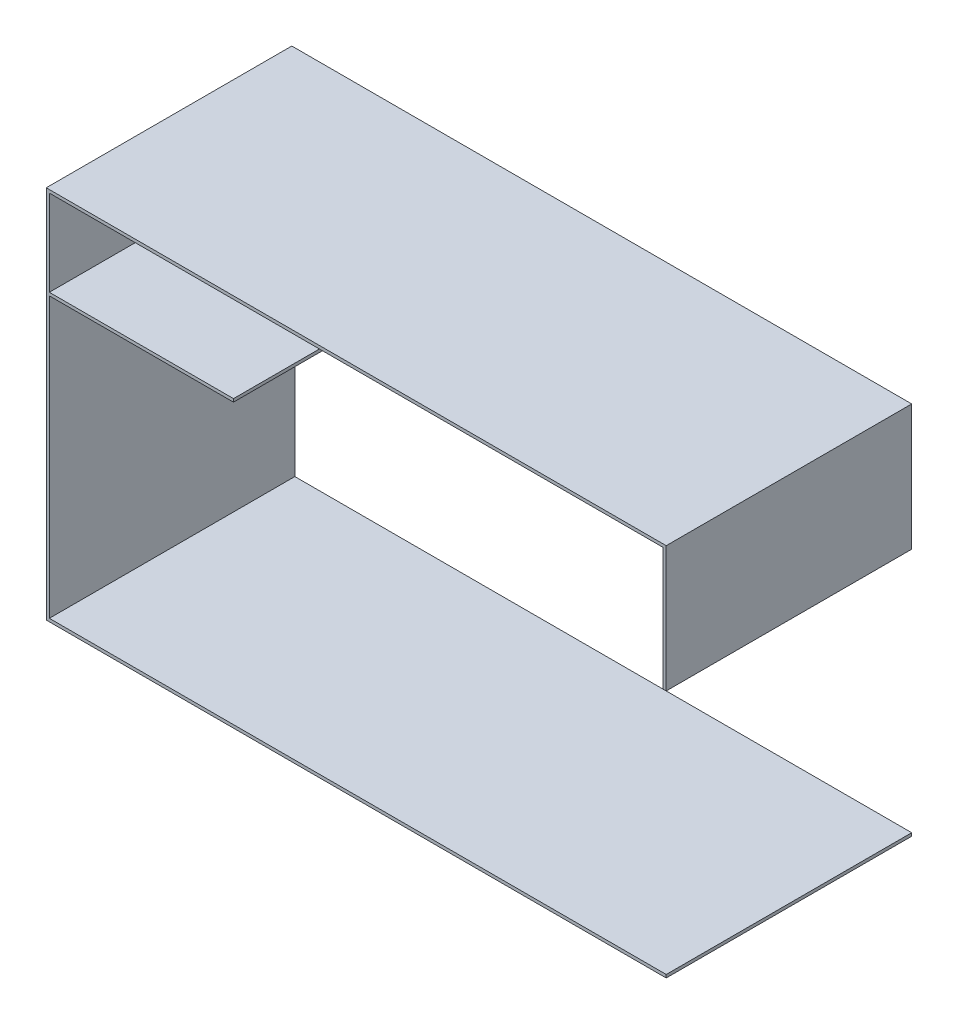
ISO-10303-21;
HEADER;
FILE_DESCRIPTION(('STEP AP214'),'2;1');
FILE_NAME('part.step','',(''),(''),'','','');
FILE_SCHEMA(('AUTOMOTIVE_DESIGN { 1 0 10303 214 1 1 1 1 }'));
ENDSEC;
DATA;
#1=APPLICATION_CONTEXT('core data for automotive mechanical design processes');
#2=APPLICATION_PROTOCOL_DEFINITION('international standard','automotive_design',2000,#1);
#3=PRODUCT_CONTEXT('',#1,'mechanical');
#4=PRODUCT('Part','Part','',(#3));
#5=PRODUCT_RELATED_PRODUCT_CATEGORY('part','',(#4));
#6=PRODUCT_DEFINITION_FORMATION('','',#4);
#7=PRODUCT_DEFINITION_CONTEXT('part definition',#1,'design');
#8=PRODUCT_DEFINITION('design','',#6,#7);
#9=PRODUCT_DEFINITION_SHAPE('','',#8);
#10=(LENGTH_UNIT() NAMED_UNIT(*) SI_UNIT(.MILLI.,.METRE.));
#11=(NAMED_UNIT(*) PLANE_ANGLE_UNIT() SI_UNIT($,.RADIAN.));
#12=(NAMED_UNIT(*) SI_UNIT($,.STERADIAN.) SOLID_ANGLE_UNIT());
#13=UNCERTAINTY_MEASURE_WITH_UNIT(LENGTH_MEASURE(1.E-05),#10,'distance_accuracy_value','');
#14=(GEOMETRIC_REPRESENTATION_CONTEXT(3) GLOBAL_UNCERTAINTY_ASSIGNED_CONTEXT((#13)) GLOBAL_UNIT_ASSIGNED_CONTEXT((#10,
#11,#12)) REPRESENTATION_CONTEXT('',''));
#15=CARTESIAN_POINT('',(0.,0.,0.));
#16=DIRECTION('',(0.,0.,1.));
#17=DIRECTION('',(1.,0.,0.));
#18=AXIS2_PLACEMENT_3D('',#15,#16,#17);
#19=CARTESIAN_POINT('',(-2500.,-1500.,2000.));
#20=DIRECTION('',(-1.,0.,0.));
#21=DIRECTION('',(0.,0.,1.));
#22=AXIS2_PLACEMENT_3D('',#19,#20,#21);
#23=PLANE('',#22);
#24=DIRECTION('',(0.,1.,0.));
#25=VECTOR('',#24,1.);
#26=CARTESIAN_POINT('',(-2500.,-1500.,0.));
#27=LINE('',#26,#25);
#28=CARTESIAN_POINT('',(-2500.,-1500.,0.));
#29=VERTEX_POINT('',#28);
#30=CARTESIAN_POINT('',(-2500.,775.,0.));
#31=VERTEX_POINT('',#30);
#32=EDGE_CURVE('E172',#29,#31,#27,.T.);
#33=ORIENTED_EDGE('',*,*,#32,.T.);
#34=DIRECTION('',(0.,0.,-1.));
#35=VECTOR('',#34,1.);
#36=CARTESIAN_POINT('',(-2500.,775.,2000.));
#37=LINE('',#36,#35);
#38=CARTESIAN_POINT('',(-2500.,775.,2000.));
#39=VERTEX_POINT('',#38);
#40=EDGE_CURVE('E44',#39,#31,#37,.T.);
#41=ORIENTED_EDGE('',*,*,#40,.F.);
#42=DIRECTION('',(0.,1.,0.));
#43=VECTOR('',#42,1.);
#44=CARTESIAN_POINT('',(-2500.,-1500.,2000.));
#45=LINE('',#44,#43);
#46=CARTESIAN_POINT('',(-2500.,-1500.,2000.));
#47=VERTEX_POINT('',#46);
#48=EDGE_CURVE('E114',#47,#39,#45,.T.);
#49=ORIENTED_EDGE('',*,*,#48,.F.);
#50=DIRECTION('',(0.,0.,-1.));
#51=VECTOR('',#50,1.);
#52=CARTESIAN_POINT('',(-2500.,-1500.,2000.));
#53=LINE('',#52,#51);
#54=EDGE_CURVE('E11',#47,#29,#53,.T.);
#55=ORIENTED_EDGE('',*,*,#54,.T.);
#56=EDGE_LOOP('',(#33,#41,#49,#55));
#57=FACE_BOUND('',#56,.T.);
#58=ADVANCED_FACE('F36',(#57),#23,.F.);
#59=CARTESIAN_POINT('',(-1000.,775.,2000.));
#60=DIRECTION('',(0.,-1.,0.));
#61=DIRECTION('',(1.,0.,0.));
#62=AXIS2_PLACEMENT_3D('',#59,#60,#61);
#63=PLANE('',#62);
#64=DIRECTION('',(-1.,0.,0.));
#65=VECTOR('',#64,1.);
#66=CARTESIAN_POINT('',(-1000.,775.,0.));
#67=LINE('',#66,#65);
#68=CARTESIAN_POINT('',(-1000.,775.,0.));
#69=VERTEX_POINT('',#68);
#70=EDGE_CURVE('E175',#69,#31,#67,.T.);
#71=ORIENTED_EDGE('',*,*,#70,.F.);
#72=DIRECTION('',(0.,0.,-1.));
#73=VECTOR('',#72,1.);
#74=CARTESIAN_POINT('',(-1000.,775.,2000.));
#75=LINE('',#74,#73);
#76=CARTESIAN_POINT('',(-1000.,775.,2000.));
#77=VERTEX_POINT('',#76);
#78=EDGE_CURVE('E223',#77,#69,#75,.T.);
#79=ORIENTED_EDGE('',*,*,#78,.F.);
#80=DIRECTION('',(-1.,0.,0.));
#81=VECTOR('',#80,1.);
#82=CARTESIAN_POINT('',(-1000.,775.,2000.));
#83=LINE('',#82,#81);
#84=EDGE_CURVE('E229',#77,#39,#83,.T.);
#85=ORIENTED_EDGE('',*,*,#84,.T.);
#86=ORIENTED_EDGE('',*,*,#40,.T.);
#87=EDGE_LOOP('',(#71,#79,#85,#86));
#88=FACE_BOUND('',#87,.T.);
#89=ADVANCED_FACE('F227',(#88),#63,.T.);
#90=CARTESIAN_POINT('',(-1000.,800.,2000.));
#91=DIRECTION('',(1.,0.,0.));
#92=DIRECTION('',(0.,1.,0.));
#93=AXIS2_PLACEMENT_3D('',#90,#91,#92);
#94=PLANE('',#93);
#95=DIRECTION('',(0.,-1.,0.));
#96=VECTOR('',#95,1.);
#97=CARTESIAN_POINT('',(-1000.,800.,0.));
#98=LINE('',#97,#96);
#99=CARTESIAN_POINT('',(-1000.,800.,0.));
#100=VERTEX_POINT('',#99);
#101=EDGE_CURVE('E178',#100,#69,#98,.T.);
#102=ORIENTED_EDGE('',*,*,#101,.F.);
#103=DIRECTION('',(0.,0.,-1.));
#104=VECTOR('',#103,1.);
#105=CARTESIAN_POINT('',(-1000.,800.,2000.));
#106=LINE('',#105,#104);
#107=CARTESIAN_POINT('',(-1000.,800.,2000.));
#108=VERTEX_POINT('',#107);
#109=EDGE_CURVE('E221',#108,#100,#106,.T.);
#110=ORIENTED_EDGE('',*,*,#109,.F.);
#111=DIRECTION('',(0.,-1.,0.));
#112=VECTOR('',#111,1.);
#113=CARTESIAN_POINT('',(-1000.,800.,2000.));
#114=LINE('',#113,#112);
#115=EDGE_CURVE('E241',#108,#77,#114,.T.);
#116=ORIENTED_EDGE('',*,*,#115,.T.);
#117=ORIENTED_EDGE('',*,*,#78,.T.);
#118=EDGE_LOOP('',(#102,#110,#116,#117));
#119=FACE_BOUND('',#118,.T.);
#120=ADVANCED_FACE('F238',(#119),#94,.T.);
#121=CARTESIAN_POINT('',(-2500.,800.,2000.));
#122=DIRECTION('',(0.,1.,0.));
#123=DIRECTION('',(-1.,0.,0.));
#124=AXIS2_PLACEMENT_3D('',#121,#122,#123);
#125=PLANE('',#124);
#126=DIRECTION('',(1.,0.,0.));
#127=VECTOR('',#126,1.);
#128=CARTESIAN_POINT('',(-2500.,800.,0.));
#129=LINE('',#128,#127);
#130=CARTESIAN_POINT('',(-2500.,800.,0.));
#131=VERTEX_POINT('',#130);
#132=EDGE_CURVE('E181',#131,#100,#129,.T.);
#133=ORIENTED_EDGE('',*,*,#132,.F.);
#134=DIRECTION('',(0.,0.,-1.));
#135=VECTOR('',#134,1.);
#136=CARTESIAN_POINT('',(-2500.,800.,2000.));
#137=LINE('',#136,#135);
#138=CARTESIAN_POINT('',(-2500.,800.,2000.));
#139=VERTEX_POINT('',#138);
#140=EDGE_CURVE('E219',#139,#131,#137,.T.);
#141=ORIENTED_EDGE('',*,*,#140,.F.);
#142=DIRECTION('',(1.,0.,0.));
#143=VECTOR('',#142,1.);
#144=CARTESIAN_POINT('',(-2500.,800.,2000.));
#145=LINE('',#144,#143);
#146=EDGE_CURVE('E245',#139,#108,#145,.T.);
#147=ORIENTED_EDGE('',*,*,#146,.T.);
#148=ORIENTED_EDGE('',*,*,#109,.T.);
#149=EDGE_LOOP('',(#133,#141,#147,#148));
#150=FACE_BOUND('',#149,.T.);
#151=ADVANCED_FACE('F288',(#150),#125,.T.);
#152=CARTESIAN_POINT('',(-2500.,800.,2000.));
#153=DIRECTION('',(-1.,0.,0.));
#154=DIRECTION('',(0.,0.,1.));
#155=AXIS2_PLACEMENT_3D('',#152,#153,#154);
#156=PLANE('',#155);
#157=DIRECTION('',(0.,1.,0.));
#158=VECTOR('',#157,1.);
#159=CARTESIAN_POINT('',(-2500.,800.,0.));
#160=LINE('',#159,#158);
#161=CARTESIAN_POINT('',(-2500.,1500.,0.));
#162=VERTEX_POINT('',#161);
#163=EDGE_CURVE('E184',#131,#162,#160,.T.);
#164=ORIENTED_EDGE('',*,*,#163,.T.);
#165=DIRECTION('',(0.,0.,-1.));
#166=VECTOR('',#165,1.);
#167=CARTESIAN_POINT('',(-2500.,1500.,2000.));
#168=LINE('',#167,#166);
#169=CARTESIAN_POINT('',(-2500.,1500.,2000.));
#170=VERTEX_POINT('',#169);
#171=EDGE_CURVE('E217',#170,#162,#168,.T.);
#172=ORIENTED_EDGE('',*,*,#171,.F.);
#173=DIRECTION('',(0.,1.,0.));
#174=VECTOR('',#173,1.);
#175=CARTESIAN_POINT('',(-2500.,800.,2000.));
#176=LINE('',#175,#174);
#177=EDGE_CURVE('E251',#139,#170,#176,.T.);
#178=ORIENTED_EDGE('',*,*,#177,.F.);
#179=ORIENTED_EDGE('',*,*,#140,.T.);
#180=EDGE_LOOP('',(#164,#172,#178,#179));
#181=FACE_BOUND('',#180,.T.);
#182=ADVANCED_FACE('F293',(#181),#156,.F.);
#183=CARTESIAN_POINT('',(2500.,1500.,2000.));
#184=DIRECTION('',(0.,-1.,0.));
#185=DIRECTION('',(0.,0.,-1.));
#186=AXIS2_PLACEMENT_3D('',#183,#184,#185);
#187=PLANE('',#186);
#188=DIRECTION('',(-1.,0.,0.));
#189=VECTOR('',#188,1.);
#190=CARTESIAN_POINT('',(2500.,1500.,0.));
#191=LINE('',#190,#189);
#192=CARTESIAN_POINT('',(2500.,1500.,0.));
#193=VERTEX_POINT('',#192);
#194=EDGE_CURVE('E187',#193,#162,#191,.T.);
#195=ORIENTED_EDGE('',*,*,#194,.F.);
#196=DIRECTION('',(0.,0.,-1.));
#197=VECTOR('',#196,1.);
#198=CARTESIAN_POINT('',(2500.,1500.,2000.));
#199=LINE('',#198,#197);
#200=CARTESIAN_POINT('',(2500.,1500.,2000.));
#201=VERTEX_POINT('',#200);
#202=EDGE_CURVE('E215',#201,#193,#199,.T.);
#203=ORIENTED_EDGE('',*,*,#202,.F.);
#204=DIRECTION('',(-1.,0.,0.));
#205=VECTOR('',#204,1.);
#206=CARTESIAN_POINT('',(2500.,1500.,2000.));
#207=LINE('',#206,#205);
#208=EDGE_CURVE('E253',#201,#170,#207,.T.);
#209=ORIENTED_EDGE('',*,*,#208,.T.);
#210=ORIENTED_EDGE('',*,*,#171,.T.);
#211=EDGE_LOOP('',(#195,#203,#209,#210));
#212=FACE_BOUND('',#211,.T.);
#213=ADVANCED_FACE('F297',(#212),#187,.T.);
#214=CARTESIAN_POINT('',(2500.,1500.,2000.));
#215=DIRECTION('',(1.,0.,0.));
#216=DIRECTION('',(0.,0.,-1.));
#217=AXIS2_PLACEMENT_3D('',#214,#215,#216);
#218=PLANE('',#217);
#219=DIRECTION('',(0.,-1.,0.));
#220=VECTOR('',#219,1.);
#221=CARTESIAN_POINT('',(2500.,1500.,0.));
#222=LINE('',#221,#220);
#223=CARTESIAN_POINT('',(2500.,500.000000000001,0.));
#224=VERTEX_POINT('',#223);
#225=EDGE_CURVE('E190',#193,#224,#222,.T.);
#226=ORIENTED_EDGE('',*,*,#225,.T.);
#227=DIRECTION('',(0.,0.,-1.));
#228=VECTOR('',#227,1.);
#229=CARTESIAN_POINT('',(2500.,500.000000000001,2000.));
#230=LINE('',#229,#228);
#231=CARTESIAN_POINT('',(2500.,500.000000000001,2000.));
#232=VERTEX_POINT('',#231);
#233=EDGE_CURVE('E212',#232,#224,#230,.T.);
#234=ORIENTED_EDGE('',*,*,#233,.F.);
#235=DIRECTION('',(0.,-1.,0.));
#236=VECTOR('',#235,1.);
#237=CARTESIAN_POINT('',(2500.,1500.,2000.));
#238=LINE('',#237,#236);
#239=EDGE_CURVE('E256',#201,#232,#238,.T.);
#240=ORIENTED_EDGE('',*,*,#239,.F.);
#241=ORIENTED_EDGE('',*,*,#202,.T.);
#242=EDGE_LOOP('',(#226,#234,#240,#241));
#243=FACE_BOUND('',#242,.T.);
#244=ADVANCED_FACE('F301',(#243),#218,.F.);
#245=CARTESIAN_POINT('',(2500.,500.000000000001,2000.));
#246=DIRECTION('',(0.,1.,0.));
#247=DIRECTION('',(-1.,0.,0.));
#248=AXIS2_PLACEMENT_3D('',#245,#246,#247);
#249=PLANE('',#248);
#250=DIRECTION('',(1.,0.,0.));
#251=VECTOR('',#250,1.);
#252=CARTESIAN_POINT('',(2500.,500.000000000001,0.));
#253=LINE('',#252,#251);
#254=CARTESIAN_POINT('',(2525.,500.,0.));
#255=VERTEX_POINT('',#254);
#256=EDGE_CURVE('E192',#224,#255,#253,.T.);
#257=ORIENTED_EDGE('',*,*,#256,.T.);
#258=DIRECTION('',(0.,0.,-1.));
#259=VECTOR('',#258,1.);
#260=CARTESIAN_POINT('',(2525.,500.,2000.));
#261=LINE('',#260,#259);
#262=CARTESIAN_POINT('',(2525.,500.,2000.));
#263=VERTEX_POINT('',#262);
#264=EDGE_CURVE('E209',#263,#255,#261,.T.);
#265=ORIENTED_EDGE('',*,*,#264,.F.);
#266=DIRECTION('',(1.,0.,0.));
#267=VECTOR('',#266,1.);
#268=CARTESIAN_POINT('',(2500.,500.000000000001,2000.));
#269=LINE('',#268,#267);
#270=EDGE_CURVE('E258',#232,#263,#269,.T.);
#271=ORIENTED_EDGE('',*,*,#270,.F.);
#272=ORIENTED_EDGE('',*,*,#233,.T.);
#273=EDGE_LOOP('',(#257,#265,#271,#272));
#274=FACE_BOUND('',#273,.T.);
#275=ADVANCED_FACE('F305',(#274),#249,.F.);
#276=CARTESIAN_POINT('',(2525.,500.,2000.));
#277=DIRECTION('',(-1.,0.,0.));
#278=DIRECTION('',(0.,0.,1.));
#279=AXIS2_PLACEMENT_3D('',#276,#277,#278);
#280=PLANE('',#279);
#281=DIRECTION('',(0.,1.,0.));
#282=VECTOR('',#281,1.);
#283=CARTESIAN_POINT('',(2525.,500.,0.));
#284=LINE('',#283,#282);
#285=CARTESIAN_POINT('',(2525.,1525.,0.));
#286=VERTEX_POINT('',#285);
#287=EDGE_CURVE('E194',#255,#286,#284,.T.);
#288=ORIENTED_EDGE('',*,*,#287,.T.);
#289=DIRECTION('',(0.,0.,-1.));
#290=VECTOR('',#289,1.);
#291=CARTESIAN_POINT('',(2525.,1525.,2000.));
#292=LINE('',#291,#290);
#293=CARTESIAN_POINT('',(2525.,1525.,2000.));
#294=VERTEX_POINT('',#293);
#295=EDGE_CURVE('E206',#294,#286,#292,.T.);
#296=ORIENTED_EDGE('',*,*,#295,.F.);
#297=DIRECTION('',(0.,1.,0.));
#298=VECTOR('',#297,1.);
#299=CARTESIAN_POINT('',(2525.,500.,2000.));
#300=LINE('',#299,#298);
#301=EDGE_CURVE('E260',#263,#294,#300,.T.);
#302=ORIENTED_EDGE('',*,*,#301,.F.);
#303=ORIENTED_EDGE('',*,*,#264,.T.);
#304=EDGE_LOOP('',(#288,#296,#302,#303));
#305=FACE_BOUND('',#304,.T.);
#306=ADVANCED_FACE('F266',(#305),#280,.F.);
#307=CARTESIAN_POINT('',(2525.,1525.,2000.));
#308=DIRECTION('',(0.,-1.,0.));
#309=DIRECTION('',(1.,0.,0.));
#310=AXIS2_PLACEMENT_3D('',#307,#308,#309);
#311=PLANE('',#310);
#312=DIRECTION('',(-1.,0.,0.));
#313=VECTOR('',#312,1.);
#314=CARTESIAN_POINT('',(2525.,1525.,0.));
#315=LINE('',#314,#313);
#316=CARTESIAN_POINT('',(-2525.,1525.,0.));
#317=VERTEX_POINT('',#316);
#318=EDGE_CURVE('E196',#286,#317,#315,.T.);
#319=ORIENTED_EDGE('',*,*,#318,.T.);
#320=DIRECTION('',(0.,0.,-1.));
#321=VECTOR('',#320,1.);
#322=CARTESIAN_POINT('',(-2525.,1525.,2000.));
#323=LINE('',#322,#321);
#324=CARTESIAN_POINT('',(-2525.,1525.,2000.));
#325=VERTEX_POINT('',#324);
#326=EDGE_CURVE('E161',#325,#317,#323,.T.);
#327=ORIENTED_EDGE('',*,*,#326,.F.);
#328=DIRECTION('',(-1.,0.,0.));
#329=VECTOR('',#328,1.);
#330=CARTESIAN_POINT('',(2525.,1525.,2000.));
#331=LINE('',#330,#329);
#332=EDGE_CURVE('E152',#294,#325,#331,.T.);
#333=ORIENTED_EDGE('',*,*,#332,.F.);
#334=ORIENTED_EDGE('',*,*,#295,.T.);
#335=EDGE_LOOP('',(#319,#327,#333,#334));
#336=FACE_BOUND('',#335,.T.);
#337=ADVANCED_FACE('F270',(#336),#311,.F.);
#338=CARTESIAN_POINT('',(-2525.,1525.,2000.));
#339=DIRECTION('',(1.,0.,0.));
#340=DIRECTION('',(0.,1.,0.));
#341=AXIS2_PLACEMENT_3D('',#338,#339,#340);
#342=PLANE('',#341);
#343=DIRECTION('',(0.,-1.,0.));
#344=VECTOR('',#343,1.);
#345=CARTESIAN_POINT('',(-2525.,1525.,0.));
#346=LINE('',#345,#344);
#347=CARTESIAN_POINT('',(-2525.,-1525.,0.));
#348=VERTEX_POINT('',#347);
#349=EDGE_CURVE('E160',#317,#348,#346,.T.);
#350=ORIENTED_EDGE('',*,*,#349,.T.);
#351=DIRECTION('',(0.,0.,-1.));
#352=VECTOR('',#351,1.);
#353=CARTESIAN_POINT('',(-2525.,-1525.,2000.));
#354=LINE('',#353,#352);
#355=CARTESIAN_POINT('',(-2525.,-1525.,2000.));
#356=VERTEX_POINT('',#355);
#357=EDGE_CURVE('E157',#356,#348,#354,.T.);
#358=ORIENTED_EDGE('',*,*,#357,.F.);
#359=DIRECTION('',(0.,-1.,0.));
#360=VECTOR('',#359,1.);
#361=CARTESIAN_POINT('',(-2525.,1525.,2000.));
#362=LINE('',#361,#360);
#363=EDGE_CURVE('E146',#325,#356,#362,.T.);
#364=ORIENTED_EDGE('',*,*,#363,.F.);
#365=ORIENTED_EDGE('',*,*,#326,.T.);
#366=EDGE_LOOP('',(#350,#358,#364,#365));
#367=FACE_BOUND('',#366,.T.);
#368=ADVANCED_FACE('F158',(#367),#342,.F.);
#369=CARTESIAN_POINT('',(-2525.,-1525.,2000.));
#370=DIRECTION('',(0.,1.,0.));
#371=DIRECTION('',(0.,0.,1.));
#372=AXIS2_PLACEMENT_3D('',#369,#370,#371);
#373=PLANE('',#372);
#374=DIRECTION('',(1.,0.,0.));
#375=VECTOR('',#374,1.);
#376=CARTESIAN_POINT('',(-2525.,-1525.,0.));
#377=LINE('',#376,#375);
#378=CARTESIAN_POINT('',(2525.,-1525.,0.));
#379=VERTEX_POINT('',#378);
#380=EDGE_CURVE('E100',#348,#379,#377,.T.);
#381=ORIENTED_EDGE('',*,*,#380,.T.);
#382=DIRECTION('',(0.,0.,-1.));
#383=VECTOR('',#382,1.);
#384=CARTESIAN_POINT('',(2525.,-1525.,2000.));
#385=LINE('',#384,#383);
#386=CARTESIAN_POINT('',(2525.,-1525.,2000.));
#387=VERTEX_POINT('',#386);
#388=EDGE_CURVE('E162',#387,#379,#385,.T.);
#389=ORIENTED_EDGE('',*,*,#388,.F.);
#390=DIRECTION('',(1.,0.,0.));
#391=VECTOR('',#390,1.);
#392=CARTESIAN_POINT('',(-2525.,-1525.,2000.));
#393=LINE('',#392,#391);
#394=EDGE_CURVE('E150',#356,#387,#393,.T.);
#395=ORIENTED_EDGE('',*,*,#394,.F.);
#396=ORIENTED_EDGE('',*,*,#357,.T.);
#397=EDGE_LOOP('',(#381,#389,#395,#396));
#398=FACE_BOUND('',#397,.T.);
#399=ADVANCED_FACE('F164',(#398),#373,.F.);
#400=CARTESIAN_POINT('',(2525.,-1525.,2000.));
#401=DIRECTION('',(-1.,0.,0.));
#402=DIRECTION('',(0.,0.,1.));
#403=AXIS2_PLACEMENT_3D('',#400,#401,#402);
#404=PLANE('',#403);
#405=DIRECTION('',(0.,1.,0.));
#406=VECTOR('',#405,1.);
#407=CARTESIAN_POINT('',(2525.,-1525.,0.));
#408=LINE('',#407,#406);
#409=CARTESIAN_POINT('',(2525.,-1500.,0.));
#410=VERTEX_POINT('',#409);
#411=EDGE_CURVE('E107',#379,#410,#408,.T.);
#412=ORIENTED_EDGE('',*,*,#411,.T.);
#413=DIRECTION('',(0.,0.,-1.));
#414=VECTOR('',#413,1.);
#415=CARTESIAN_POINT('',(2525.,-1500.,2000.));
#416=LINE('',#415,#414);
#417=CARTESIAN_POINT('',(2525.,-1500.,2000.));
#418=VERTEX_POINT('',#417);
#419=EDGE_CURVE('E168',#418,#410,#416,.T.);
#420=ORIENTED_EDGE('',*,*,#419,.F.);
#421=DIRECTION('',(0.,1.,0.));
#422=VECTOR('',#421,1.);
#423=CARTESIAN_POINT('',(2525.,-1525.,2000.));
#424=LINE('',#423,#422);
#425=EDGE_CURVE('E166',#387,#418,#424,.T.);
#426=ORIENTED_EDGE('',*,*,#425,.F.);
#427=ORIENTED_EDGE('',*,*,#388,.T.);
#428=EDGE_LOOP('',(#412,#420,#426,#427));
#429=FACE_BOUND('',#428,.T.);
#430=ADVANCED_FACE('F272',(#429),#404,.F.);
#431=CARTESIAN_POINT('',(2525.,-1500.,2000.));
#432=DIRECTION('',(0.,-1.,0.));
#433=DIRECTION('',(1.,0.,0.));
#434=AXIS2_PLACEMENT_3D('',#431,#432,#433);
#435=PLANE('',#434);
#436=DIRECTION('',(-1.,0.,0.));
#437=VECTOR('',#436,1.);
#438=CARTESIAN_POINT('',(2525.,-1500.,0.));
#439=LINE('',#438,#437);
#440=EDGE_CURVE('E201',#410,#29,#439,.T.);
#441=ORIENTED_EDGE('',*,*,#440,.T.);
#442=ORIENTED_EDGE('',*,*,#54,.F.);
#443=DIRECTION('',(-1.,0.,0.));
#444=VECTOR('',#443,1.);
#445=CARTESIAN_POINT('',(2500.,-1500.,2000.));
#446=LINE('',#445,#444);
#447=EDGE_CURVE('E52',#418,#47,#446,.T.);
#448=ORIENTED_EDGE('',*,*,#447,.F.);
#449=ORIENTED_EDGE('',*,*,#419,.T.);
#450=EDGE_LOOP('',(#441,#442,#448,#449));
#451=FACE_BOUND('',#450,.T.);
#452=ADVANCED_FACE('F271',(#451),#435,.F.);
#453=CARTESIAN_POINT('',(0.,0.,2000.));
#454=DIRECTION('',(0.,0.,-1.));
#455=DIRECTION('',(-1.,0.,0.));
#456=AXIS2_PLACEMENT_3D('',#453,#454,#455);
#457=PLANE('',#456);
#458=ORIENTED_EDGE('',*,*,#447,.T.);
#459=ORIENTED_EDGE('',*,*,#48,.T.);
#460=ORIENTED_EDGE('',*,*,#84,.F.);
#461=ORIENTED_EDGE('',*,*,#115,.F.);
#462=ORIENTED_EDGE('',*,*,#146,.F.);
#463=ORIENTED_EDGE('',*,*,#177,.T.);
#464=ORIENTED_EDGE('',*,*,#208,.F.);
#465=ORIENTED_EDGE('',*,*,#239,.T.);
#466=ORIENTED_EDGE('',*,*,#270,.T.);
#467=ORIENTED_EDGE('',*,*,#301,.T.);
#468=ORIENTED_EDGE('',*,*,#332,.T.);
#469=ORIENTED_EDGE('',*,*,#363,.T.);
#470=ORIENTED_EDGE('',*,*,#394,.T.);
#471=ORIENTED_EDGE('',*,*,#425,.T.);
#472=EDGE_LOOP('',(#458,#459,#460,#461,#462,#463,#464,#465,#466,#467,#468,#469,#470,#471));
#473=FACE_BOUND('',#472,.T.);
#474=ADVANCED_FACE('F148',(#473),#457,.F.);
#475=CARTESIAN_POINT('',(0.,0.,0.));
#476=DIRECTION('',(0.,0.,-1.));
#477=DIRECTION('',(-1.,0.,0.));
#478=AXIS2_PLACEMENT_3D('',#475,#476,#477);
#479=PLANE('',#478);
#480=ORIENTED_EDGE('',*,*,#32,.F.);
#481=ORIENTED_EDGE('',*,*,#440,.F.);
#482=ORIENTED_EDGE('',*,*,#411,.F.);
#483=ORIENTED_EDGE('',*,*,#380,.F.);
#484=ORIENTED_EDGE('',*,*,#349,.F.);
#485=ORIENTED_EDGE('',*,*,#318,.F.);
#486=ORIENTED_EDGE('',*,*,#287,.F.);
#487=ORIENTED_EDGE('',*,*,#256,.F.);
#488=ORIENTED_EDGE('',*,*,#225,.F.);
#489=ORIENTED_EDGE('',*,*,#194,.T.);
#490=ORIENTED_EDGE('',*,*,#163,.F.);
#491=ORIENTED_EDGE('',*,*,#132,.T.);
#492=ORIENTED_EDGE('',*,*,#101,.T.);
#493=ORIENTED_EDGE('',*,*,#70,.T.);
#494=EDGE_LOOP('',(#480,#481,#482,#483,#484,#485,#486,#487,#488,#489,#490,#491,#492,#493));
#495=FACE_BOUND('',#494,.T.);
#496=ADVANCED_FACE('F233',(#495),#479,.T.);
#497=CLOSED_SHELL('',(#58,#89,#120,#151,#182,#213,#244,#275,#306,#337,#368,#399,#430,#452,#474,#496));
#498=MANIFOLD_SOLID_BREP('B2',#497);
#499=ADVANCED_BREP_SHAPE_REPRESENTATION('',(#18,#498),#14);
#500=SHAPE_DEFINITION_REPRESENTATION(#9,#499);
ENDSEC;
END-ISO-10303-21;
